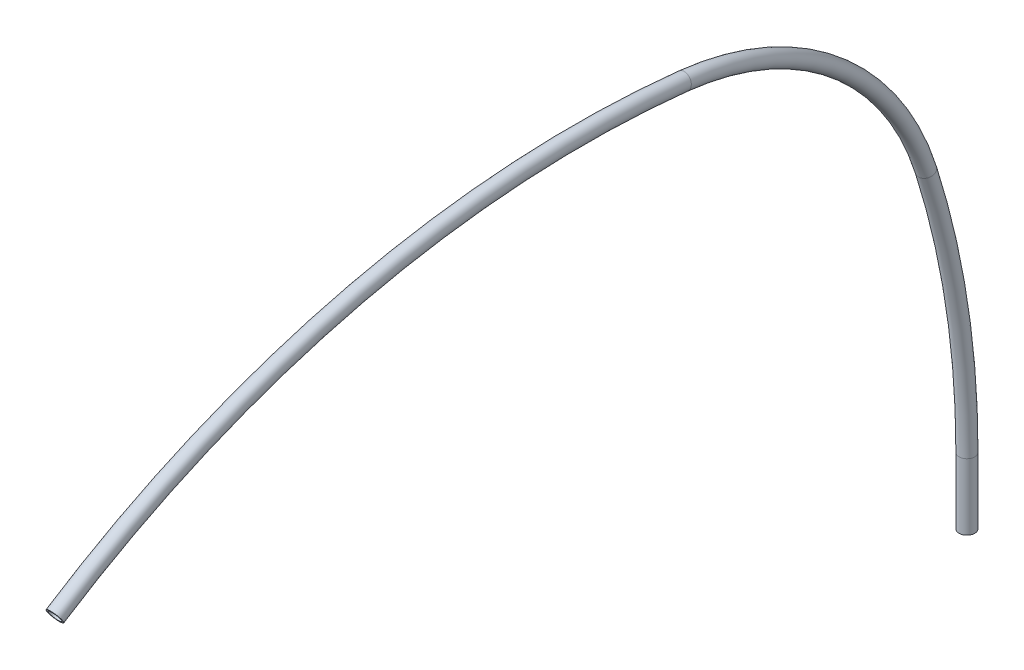
ISO-10303-21;
HEADER;
FILE_DESCRIPTION(('STEP AP214'),'2;1');
FILE_NAME('part.step','',(''),(''),'','','');
FILE_SCHEMA(('AUTOMOTIVE_DESIGN { 1 0 10303 214 1 1 1 1 }'));
ENDSEC;
DATA;
#1=APPLICATION_CONTEXT('core data for automotive mechanical design processes');
#2=APPLICATION_PROTOCOL_DEFINITION('international standard','automotive_design',2000,#1);
#3=PRODUCT_CONTEXT('',#1,'mechanical');
#4=PRODUCT('Part','Part','',(#3));
#5=PRODUCT_RELATED_PRODUCT_CATEGORY('part','',(#4));
#6=PRODUCT_DEFINITION_FORMATION('','',#4);
#7=PRODUCT_DEFINITION_CONTEXT('part definition',#1,'design');
#8=PRODUCT_DEFINITION('design','',#6,#7);
#9=PRODUCT_DEFINITION_SHAPE('','',#8);
#10=(LENGTH_UNIT() NAMED_UNIT(*) SI_UNIT(.MILLI.,.METRE.));
#11=(NAMED_UNIT(*) PLANE_ANGLE_UNIT() SI_UNIT($,.RADIAN.));
#12=(NAMED_UNIT(*) SI_UNIT($,.STERADIAN.) SOLID_ANGLE_UNIT());
#13=UNCERTAINTY_MEASURE_WITH_UNIT(LENGTH_MEASURE(1.E-05),#10,'distance_accuracy_value','');
#14=(GEOMETRIC_REPRESENTATION_CONTEXT(3) GLOBAL_UNCERTAINTY_ASSIGNED_CONTEXT((#13)) GLOBAL_UNIT_ASSIGNED_CONTEXT((#10,
#11,#12)) REPRESENTATION_CONTEXT('',''));
#15=CARTESIAN_POINT('',(0.,0.,0.));
#16=DIRECTION('',(0.,0.,1.));
#17=DIRECTION('',(1.,0.,0.));
#18=AXIS2_PLACEMENT_3D('',#15,#16,#17);
#19=CARTESIAN_POINT('',(0.,-235.741653141692,247.662939856084));
#20=DIRECTION('',(1.,0.,0.));
#21=DIRECTION('',(0.,0.,-1.));
#22=AXIS2_PLACEMENT_3D('',#19,#20,#21);
#23=TOROIDAL_SURFACE('',#22,618.018433937409,5.);
#24=CARTESIAN_POINT('',(0.,378.703607921638,181.301762626741));
#25=DIRECTION('',(0.,0.107377342786613,0.99421833932798));
#26=DIRECTION('',(0.,-0.99421833932798,0.107377342786613));
#27=AXIS2_PLACEMENT_3D('',#24,#25,#26);
#28=CIRCLE('',#27,5.);
#29=CARTESIAN_POINT('',(0.,383.674699618278,180.764875912808));
#30=VERTEX_POINT('',#29);
#31=EDGE_CURVE('E36',#30,#30,#28,.T.);
#32=CARTESIAN_POINT('',(0.,283.21782888428,583.263656037952));
#33=DIRECTION('',(0.,-0.543027032452331,0.839715214835372));
#34=DIRECTION('',(0.,-0.839715214835372,-0.543027032452331));
#35=AXIS2_PLACEMENT_3D('',#32,#33,#34);
#36=CIRCLE('',#35,5.);
#37=CARTESIAN_POINT('',(0.,287.416404958457,585.978791200213));
#38=VERTEX_POINT('',#37);
#39=EDGE_CURVE('E10',#38,#38,#36,.T.);
#40=CARTESIAN_POINT('',(0.,-235.741653141692,247.662939856084));
#41=DIRECTION('',(1.,0.,0.));
#42=DIRECTION('',(0.,0.,-1.));
#43=AXIS2_PLACEMENT_3D('',#40,#41,#42);
#44=CIRCLE('',#43,623.018433937409);
#45=EDGE_CURVE('',#30,#38,#44,.T.);
#46=ORIENTED_EDGE('',*,*,#31,.T.);
#47=ORIENTED_EDGE('',*,*,#39,.F.);
#48=ORIENTED_EDGE('',*,*,#45,.T.);
#49=ORIENTED_EDGE('',*,*,#45,.F.);
#50=EDGE_LOOP('',(#46,#48,#47,#49));
#51=FACE_BOUND('',#50,.T.);
#52=ADVANCED_FACE('F30',(#51),#23,.T.);
#53=CARTESIAN_POINT('',(0.,196.417143435808,200.989023873284));
#54=DIRECTION('',(1.,0.,0.));
#55=DIRECTION('',(0.,0.,-1.));
#56=AXIS2_PLACEMENT_3D('',#53,#54,#55);
#57=TOROIDAL_SURFACE('',#56,183.34651180247,5.);
#58=CARTESIAN_POINT('',(0.,251.810887526149,26.2106599211432));
#59=DIRECTION('',(0.,0.953268007304334,0.302125977449844));
#60=DIRECTION('',(0.,-0.302125977449844,0.953268007304334));
#61=AXIS2_PLACEMENT_3D('',#58,#59,#60);
#62=CIRCLE('',#61,5.);
#63=CARTESIAN_POINT('',(0.,253.321517413398,21.4443198846215));
#64=VERTEX_POINT('',#63);
#65=EDGE_CURVE('E40',#64,#64,#62,.T.);
#66=CARTESIAN_POINT('',(0.,196.417143435808,200.989023873284));
#67=DIRECTION('',(1.,0.,0.));
#68=DIRECTION('',(0.,0.,-1.));
#69=AXIS2_PLACEMENT_3D('',#66,#67,#68);
#70=CIRCLE('',#69,188.34651180247);
#71=EDGE_CURVE('',#64,#30,#70,.T.);
#72=ORIENTED_EDGE('',*,*,#65,.T.);
#73=ORIENTED_EDGE('',*,*,#31,.F.);
#74=ORIENTED_EDGE('',*,*,#71,.T.);
#75=ORIENTED_EDGE('',*,*,#71,.F.);
#76=EDGE_LOOP('',(#72,#74,#73,#75));
#77=FACE_BOUND('',#76,.T.);
#78=ADVANCED_FACE('F92',(#77),#57,.T.);
#79=CARTESIAN_POINT('',(0.,82.3569269417697,560.871865487007));
#80=DIRECTION('',(1.,0.,0.));
#81=DIRECTION('',(0.,0.,-1.));
#82=AXIS2_PLACEMENT_3D('',#79,#80,#81);
#83=TOROIDAL_SURFACE('',#82,560.871865487007,5.);
#84=CARTESIAN_POINT('',(0.,82.3569269417697,0.));
#85=DIRECTION('',(0.,1.,0.));
#86=DIRECTION('',(0.,0.,1.));
#87=AXIS2_PLACEMENT_3D('',#84,#85,#86);
#88=CIRCLE('',#87,5.);
#89=CARTESIAN_POINT('',(0.,82.3569269417697,-5.));
#90=VERTEX_POINT('',#89);
#91=EDGE_CURVE('E44',#90,#90,#88,.T.);
#92=CARTESIAN_POINT('',(0.,82.3569269417697,560.871865487007));
#93=DIRECTION('',(1.,0.,0.));
#94=DIRECTION('',(0.,0.,-1.));
#95=AXIS2_PLACEMENT_3D('',#92,#93,#94);
#96=CIRCLE('',#95,565.871865487007);
#97=EDGE_CURVE('',#90,#64,#96,.T.);
#98=ORIENTED_EDGE('',*,*,#91,.T.);
#99=ORIENTED_EDGE('',*,*,#65,.F.);
#100=ORIENTED_EDGE('',*,*,#97,.T.);
#101=ORIENTED_EDGE('',*,*,#97,.F.);
#102=EDGE_LOOP('',(#98,#100,#99,#101));
#103=FACE_BOUND('',#102,.T.);
#104=ADVANCED_FACE('F87',(#103),#83,.T.);
#105=CARTESIAN_POINT('',(0.,82.3569269417697,0.));
#106=DIRECTION('',(0.,-1.,0.));
#107=DIRECTION('',(0.,0.,-1.));
#108=AXIS2_PLACEMENT_3D('',#105,#106,#107);
#109=CYLINDRICAL_SURFACE('',#108,5.);
#110=CARTESIAN_POINT('',(0.,40.,0.));
#111=DIRECTION('',(0.,1.,0.));
#112=DIRECTION('',(0.,0.,1.));
#113=AXIS2_PLACEMENT_3D('',#110,#111,#112);
#114=CIRCLE('',#113,5.);
#115=CARTESIAN_POINT('',(0.,40.,-5.));
#116=VERTEX_POINT('',#115);
#117=EDGE_CURVE('E47',#116,#116,#114,.T.);
#118=CARTESIAN_POINT('',(0.,82.3569269417697,-5.));
#119=CARTESIAN_POINT('',(0.,81.915708952793,-5.));
#120=CARTESIAN_POINT('',(0.,81.4744909638162,-5.));
#121=CARTESIAN_POINT('',(0.,80.5920549858626,-5.));
#122=CARTESIAN_POINT('',(0.,80.1508369968859,-5.));
#123=CARTESIAN_POINT('',(0.,79.2684010189323,-5.));
#124=CARTESIAN_POINT('',(0.,78.8271830299556,-5.));
#125=CARTESIAN_POINT('',(0.,77.944747052002,-5.));
#126=CARTESIAN_POINT('',(0.,77.5035290630253,-5.));
#127=CARTESIAN_POINT('',(0.,76.6210930850717,-5.));
#128=CARTESIAN_POINT('',(0.,76.179875096095,-5.));
#129=CARTESIAN_POINT('',(0.,75.2974391181414,-5.));
#130=CARTESIAN_POINT('',(0.,74.8562211291647,-5.));
#131=CARTESIAN_POINT('',(0.,73.9737851512111,-5.));
#132=CARTESIAN_POINT('',(0.,73.5325671622344,-5.));
#133=CARTESIAN_POINT('',(0.,72.6501311842808,-5.));
#134=CARTESIAN_POINT('',(0.,72.2089131953041,-5.));
#135=CARTESIAN_POINT('',(0.,71.3264772173505,-5.));
#136=CARTESIAN_POINT('',(0.,70.8852592283738,-5.));
#137=CARTESIAN_POINT('',(0.,70.0028232504202,-5.));
#138=CARTESIAN_POINT('',(0.,69.5616052614434,-5.));
#139=CARTESIAN_POINT('',(0.,68.6791692834899,-5.));
#140=CARTESIAN_POINT('',(0.,68.2379512945131,-5.));
#141=CARTESIAN_POINT('',(0.,67.3555153165596,-5.));
#142=CARTESIAN_POINT('',(0.,66.9142973275828,-5.));
#143=CARTESIAN_POINT('',(0.,66.0318613496293,-5.));
#144=CARTESIAN_POINT('',(0.,65.5906433606525,-5.));
#145=CARTESIAN_POINT('',(0.,64.708207382699,-5.));
#146=CARTESIAN_POINT('',(0.,64.2669893937222,-5.));
#147=CARTESIAN_POINT('',(0.,63.3845534157687,-5.));
#148=CARTESIAN_POINT('',(0.,62.9433354267919,-5.));
#149=CARTESIAN_POINT('',(0.,62.0608994488384,-5.));
#150=CARTESIAN_POINT('',(0.,61.6196814598616,-5.));
#151=CARTESIAN_POINT('',(0.,60.7372454819081,-5.));
#152=CARTESIAN_POINT('',(0.,60.2960274929313,-5.));
#153=CARTESIAN_POINT('',(0.,59.4135915149778,-5.));
#154=CARTESIAN_POINT('',(0.,58.972373526001,-5.));
#155=CARTESIAN_POINT('',(0.,58.0899375480475,-5.));
#156=CARTESIAN_POINT('',(0.,57.6487195590707,-5.));
#157=CARTESIAN_POINT('',(0.,56.7662835811172,-5.));
#158=CARTESIAN_POINT('',(0.,56.3250655921404,-5.));
#159=CARTESIAN_POINT('',(0.,55.4426296141869,-5.));
#160=CARTESIAN_POINT('',(0.,55.0014116252101,-5.));
#161=CARTESIAN_POINT('',(0.,54.1189756472566,-5.));
#162=CARTESIAN_POINT('',(0.,53.6777576582798,-5.));
#163=CARTESIAN_POINT('',(0.,52.7953216803263,-5.));
#164=CARTESIAN_POINT('',(0.,52.3541036913495,-5.));
#165=CARTESIAN_POINT('',(0.,51.471667713396,-5.));
#166=CARTESIAN_POINT('',(0.,51.0304497244192,-5.));
#167=CARTESIAN_POINT('',(0.,50.1480137464657,-5.));
#168=CARTESIAN_POINT('',(0.,49.7067957574889,-5.));
#169=CARTESIAN_POINT('',(0.,48.8243597795354,-5.));
#170=CARTESIAN_POINT('',(0.,48.3831417905586,-5.));
#171=CARTESIAN_POINT('',(0.,47.5007058126051,-5.));
#172=CARTESIAN_POINT('',(0.,47.0594878236283,-5.));
#173=CARTESIAN_POINT('',(0.,46.1770518456747,-5.));
#174=CARTESIAN_POINT('',(0.,45.735833856698,-5.));
#175=CARTESIAN_POINT('',(0.,44.8533978787444,-5.));
#176=CARTESIAN_POINT('',(0.,44.4121798897677,-5.));
#177=CARTESIAN_POINT('',(0.,43.5297439118141,-5.));
#178=CARTESIAN_POINT('',(0.,43.0885259228374,-5.));
#179=CARTESIAN_POINT('',(0.,42.2060899448838,-5.));
#180=CARTESIAN_POINT('',(0.,41.7648719559071,-5.));
#181=CARTESIAN_POINT('',(0.,40.8824359779535,-5.));
#182=CARTESIAN_POINT('',(0.,40.4412179889768,-5.));
#183=CARTESIAN_POINT('',(0.,40.,-5.));
#184=B_SPLINE_CURVE_WITH_KNOTS('',3,(#118,#119,#120,#121,#122,#123,#124,#125,#126,#127,#128,
#129,#130,#131,#132,#133,#134,#135,#136,#137,#138,#139,#140,#141,#142,#143,#144,#145,#146,#147,
#148,#149,#150,#151,#152,#153,#154,#155,#156,#157,#158,#159,#160,#161,#162,#163,#164,#165,#166,
#167,#168,#169,#170,#171,#172,#173,#174,#175,#176,#177,#178,#179,#180,#181,#182,#183),
.UNSPECIFIED.,.F.,.F.,(4,2,2,2,2,2,2,2,2,2,2,2,2,2,2,2,2,2,2,2,2,2,2,2,2,2,2,2,2,2,2,2,4),(0.,
1.32365396693031,2.64730793386062,3.97096190079092,5.29461586772122,6.61826983465152,
7.94192380158183,9.26557776851213,10.5892317354424,11.9128857023727,13.236539669303,
14.5601936362334,15.8838476031636,17.207501570094,18.5311555370243,19.8548095039546,
21.1784634708849,22.5021174378152,23.8257714047455,25.1494253716758,26.4730793386061,
27.7967333055364,29.1203872724667,30.444041239397,31.7676952063273,33.0913491732576,
34.4150031401879,35.7386571071182,37.0623110740485,38.3859650409788,39.7096190079091,
41.0332729748394,42.3569269417697),.UNSPECIFIED.);
#185=EDGE_CURVE('BSEAM79',#90,#116,#184,.T.);
#186=ORIENTED_EDGE('',*,*,#91,.F.);
#187=ORIENTED_EDGE('',*,*,#117,.T.);
#188=ORIENTED_EDGE('',*,*,#185,.T.);
#189=ORIENTED_EDGE('',*,*,#185,.F.);
#190=EDGE_LOOP('',(#186,#188,#187,#189));
#191=FACE_BOUND('',#190,.T.);
#192=ADVANCED_FACE('F79',(#191),#109,.T.);
#193=CARTESIAN_POINT('',(0.,283.21782888428,583.263656037952));
#194=DIRECTION('',(0.,-0.543027032452331,0.839715214835372));
#195=DIRECTION('',(0.,-0.839715214835372,-0.543027032452331));
#196=AXIS2_PLACEMENT_3D('',#193,#194,#195);
#197=PLANE('',#196);
#198=CARTESIAN_POINT('',(0.,283.21782888428,583.263656037952));
#199=DIRECTION('',(0.,-0.543027032452331,0.839715214835372));
#200=DIRECTION('',(0.,-0.839715214835372,-0.543027032452331));
#201=AXIS2_PLACEMENT_3D('',#198,#199,#200);
#202=CIRCLE('',#201,4.);
#203=CARTESIAN_POINT('',(0.,286.576689743622,585.435764167762));
#204=VERTEX_POINT('',#203);
#205=EDGE_CURVE('E50',#204,#204,#202,.T.);
#206=ORIENTED_EDGE('',*,*,#205,.F.);
#207=EDGE_LOOP('',(#206));
#208=FACE_BOUND('',#207,.T.);
#209=ORIENTED_EDGE('',*,*,#39,.T.);
#210=EDGE_LOOP('',(#209));
#211=FACE_BOUND('',#210,.T.);
#212=ADVANCED_FACE('F77',(#208,#211),#197,.T.);
#213=CARTESIAN_POINT('',(0.,40.,0.));
#214=DIRECTION('',(0.,1.,0.));
#215=DIRECTION('',(0.,0.,1.));
#216=AXIS2_PLACEMENT_3D('',#213,#214,#215);
#217=PLANE('',#216);
#218=CARTESIAN_POINT('',(0.,40.,0.));
#219=DIRECTION('',(0.,1.,0.));
#220=DIRECTION('',(0.,0.,1.));
#221=AXIS2_PLACEMENT_3D('',#218,#219,#220);
#222=CIRCLE('',#221,4.);
#223=CARTESIAN_POINT('',(0.,40.,-4.));
#224=VERTEX_POINT('',#223);
#225=EDGE_CURVE('E53',#224,#224,#222,.T.);
#226=ORIENTED_EDGE('',*,*,#225,.T.);
#227=EDGE_LOOP('',(#226));
#228=FACE_BOUND('',#227,.T.);
#229=ORIENTED_EDGE('',*,*,#117,.F.);
#230=EDGE_LOOP('',(#229));
#231=FACE_BOUND('',#230,.T.);
#232=ADVANCED_FACE('F73',(#228,#231),#217,.F.);
#233=CARTESIAN_POINT('',(0.,-235.741653141692,247.662939856084));
#234=DIRECTION('',(1.,0.,0.));
#235=DIRECTION('',(0.,0.,-1.));
#236=AXIS2_PLACEMENT_3D('',#233,#234,#235);
#237=TOROIDAL_SURFACE('',#236,618.018433937409,4.);
#238=CARTESIAN_POINT('',(0.,378.703607921638,181.301762626741));
#239=DIRECTION('',(0.,-0.107377342786614,-0.99421833932798));
#240=DIRECTION('',(0.,0.99421833932798,-0.107377342786614));
#241=AXIS2_PLACEMENT_3D('',#238,#239,#240);
#242=CIRCLE('',#241,4.);
#243=CARTESIAN_POINT('',(0.,382.68048127895,180.872253255594));
#244=VERTEX_POINT('',#243);
#245=EDGE_CURVE('E59',#244,#244,#242,.F.);
#246=CARTESIAN_POINT('',(0.,-235.741653141692,247.662939856084));
#247=DIRECTION('',(1.,0.,0.));
#248=DIRECTION('',(0.,0.,-1.));
#249=AXIS2_PLACEMENT_3D('',#246,#247,#248);
#250=CIRCLE('',#249,622.018433937409);
#251=EDGE_CURVE('',#244,#204,#250,.T.);
#252=ORIENTED_EDGE('',*,*,#245,.F.);
#253=ORIENTED_EDGE('',*,*,#205,.T.);
#254=ORIENTED_EDGE('',*,*,#251,.T.);
#255=ORIENTED_EDGE('',*,*,#251,.F.);
#256=EDGE_LOOP('',(#252,#254,#253,#255));
#257=FACE_BOUND('',#256,.T.);
#258=ADVANCED_FACE('F70',(#257),#237,.F.);
#259=CARTESIAN_POINT('',(0.,196.417143435808,200.989023873284));
#260=DIRECTION('',(1.,0.,0.));
#261=DIRECTION('',(0.,0.,-1.));
#262=AXIS2_PLACEMENT_3D('',#259,#260,#261);
#263=TOROIDAL_SURFACE('',#262,183.34651180247,4.);
#264=CARTESIAN_POINT('',(0.,251.810887526149,26.2106599211432));
#265=DIRECTION('',(0.,-0.953268007304334,-0.302125977449843));
#266=DIRECTION('',(0.,0.302125977449843,-0.953268007304334));
#267=AXIS2_PLACEMENT_3D('',#264,#265,#266);
#268=CIRCLE('',#267,4.);
#269=CARTESIAN_POINT('',(0.,253.019391435948,22.3975878919258));
#270=VERTEX_POINT('',#269);
#271=EDGE_CURVE('E62',#270,#270,#268,.F.);
#272=CARTESIAN_POINT('',(0.,196.417143435808,200.989023873284));
#273=DIRECTION('',(1.,0.,0.));
#274=DIRECTION('',(0.,0.,-1.));
#275=AXIS2_PLACEMENT_3D('',#272,#273,#274);
#276=CIRCLE('',#275,187.34651180247);
#277=EDGE_CURVE('',#270,#244,#276,.T.);
#278=ORIENTED_EDGE('',*,*,#271,.F.);
#279=ORIENTED_EDGE('',*,*,#245,.T.);
#280=ORIENTED_EDGE('',*,*,#277,.T.);
#281=ORIENTED_EDGE('',*,*,#277,.F.);
#282=EDGE_LOOP('',(#278,#280,#279,#281));
#283=FACE_BOUND('',#282,.T.);
#284=ADVANCED_FACE('F68',(#283),#263,.F.);
#285=CARTESIAN_POINT('',(0.,82.3569269417697,560.871865487007));
#286=DIRECTION('',(1.,0.,0.));
#287=DIRECTION('',(0.,0.,-1.));
#288=AXIS2_PLACEMENT_3D('',#285,#286,#287);
#289=TOROIDAL_SURFACE('',#288,560.871865487007,4.);
#290=CARTESIAN_POINT('',(0.,82.3569269417697,0.));
#291=DIRECTION('',(0.,-1.,0.));
#292=DIRECTION('',(0.,0.,-1.));
#293=AXIS2_PLACEMENT_3D('',#290,#291,#292);
#294=CIRCLE('',#293,4.);
#295=CARTESIAN_POINT('',(0.,82.3569269417697,-4.));
#296=VERTEX_POINT('',#295);
#297=EDGE_CURVE('E56',#296,#296,#294,.F.);
#298=CARTESIAN_POINT('',(0.,82.3569269417697,560.871865487007));
#299=DIRECTION('',(1.,0.,0.));
#300=DIRECTION('',(0.,0.,-1.));
#301=AXIS2_PLACEMENT_3D('',#298,#299,#300);
#302=CIRCLE('',#301,564.871865487007);
#303=EDGE_CURVE('',#296,#270,#302,.T.);
#304=ORIENTED_EDGE('',*,*,#297,.F.);
#305=ORIENTED_EDGE('',*,*,#271,.T.);
#306=ORIENTED_EDGE('',*,*,#303,.T.);
#307=ORIENTED_EDGE('',*,*,#303,.F.);
#308=EDGE_LOOP('',(#304,#306,#305,#307));
#309=FACE_BOUND('',#308,.T.);
#310=ADVANCED_FACE('F144',(#309),#289,.F.);
#311=CARTESIAN_POINT('',(0.,82.3569269417697,0.));
#312=DIRECTION('',(0.,-1.,0.));
#313=DIRECTION('',(0.,0.,-1.));
#314=AXIS2_PLACEMENT_3D('',#311,#312,#313);
#315=CYLINDRICAL_SURFACE('',#314,4.);
#316=CARTESIAN_POINT('',(0.,82.3569269417697,-4.));
#317=CARTESIAN_POINT('',(0.,81.9157089527929,-4.));
#318=CARTESIAN_POINT('',(0.,81.4744909638162,-4.));
#319=CARTESIAN_POINT('',(0.,80.5920549858626,-4.));
#320=CARTESIAN_POINT('',(0.,80.1508369968859,-4.));
#321=CARTESIAN_POINT('',(0.,79.2684010189323,-4.));
#322=CARTESIAN_POINT('',(0.,78.8271830299556,-4.));
#323=CARTESIAN_POINT('',(0.,77.944747052002,-4.));
#324=CARTESIAN_POINT('',(0.,77.5035290630253,-4.));
#325=CARTESIAN_POINT('',(0.,76.6210930850717,-4.));
#326=CARTESIAN_POINT('',(0.,76.179875096095,-4.));
#327=CARTESIAN_POINT('',(0.,75.2974391181414,-4.));
#328=CARTESIAN_POINT('',(0.,74.8562211291647,-4.));
#329=CARTESIAN_POINT('',(0.,73.9737851512111,-4.));
#330=CARTESIAN_POINT('',(0.,73.5325671622344,-4.));
#331=CARTESIAN_POINT('',(0.,72.6501311842808,-4.));
#332=CARTESIAN_POINT('',(0.,72.2089131953041,-4.));
#333=CARTESIAN_POINT('',(0.,71.3264772173505,-4.));
#334=CARTESIAN_POINT('',(0.,70.8852592283738,-4.));
#335=CARTESIAN_POINT('',(0.,70.0028232504202,-4.));
#336=CARTESIAN_POINT('',(0.,69.5616052614434,-4.));
#337=CARTESIAN_POINT('',(0.,68.6791692834899,-4.));
#338=CARTESIAN_POINT('',(0.,68.2379512945131,-4.));
#339=CARTESIAN_POINT('',(0.,67.3555153165596,-4.));
#340=CARTESIAN_POINT('',(0.,66.9142973275828,-4.));
#341=CARTESIAN_POINT('',(0.,66.0318613496293,-4.));
#342=CARTESIAN_POINT('',(0.,65.5906433606525,-4.));
#343=CARTESIAN_POINT('',(0.,64.708207382699,-4.));
#344=CARTESIAN_POINT('',(0.,64.2669893937222,-4.));
#345=CARTESIAN_POINT('',(0.,63.3845534157687,-4.));
#346=CARTESIAN_POINT('',(0.,62.9433354267919,-4.));
#347=CARTESIAN_POINT('',(0.,62.0608994488384,-4.));
#348=CARTESIAN_POINT('',(0.,61.6196814598616,-4.));
#349=CARTESIAN_POINT('',(0.,60.7372454819081,-4.));
#350=CARTESIAN_POINT('',(0.,60.2960274929313,-4.));
#351=CARTESIAN_POINT('',(0.,59.4135915149778,-4.));
#352=CARTESIAN_POINT('',(0.,58.972373526001,-4.));
#353=CARTESIAN_POINT('',(0.,58.0899375480475,-4.));
#354=CARTESIAN_POINT('',(0.,57.6487195590707,-4.));
#355=CARTESIAN_POINT('',(0.,56.7662835811172,-4.));
#356=CARTESIAN_POINT('',(0.,56.3250655921404,-4.));
#357=CARTESIAN_POINT('',(0.,55.4426296141869,-4.));
#358=CARTESIAN_POINT('',(0.,55.0014116252101,-4.));
#359=CARTESIAN_POINT('',(0.,54.1189756472566,-4.));
#360=CARTESIAN_POINT('',(0.,53.6777576582798,-4.));
#361=CARTESIAN_POINT('',(0.,52.7953216803263,-4.));
#362=CARTESIAN_POINT('',(0.,52.3541036913495,-4.));
#363=CARTESIAN_POINT('',(0.,51.471667713396,-4.));
#364=CARTESIAN_POINT('',(0.,51.0304497244192,-4.));
#365=CARTESIAN_POINT('',(0.,50.1480137464657,-4.));
#366=CARTESIAN_POINT('',(0.,49.7067957574889,-4.));
#367=CARTESIAN_POINT('',(0.,48.8243597795354,-4.));
#368=CARTESIAN_POINT('',(0.,48.3831417905586,-4.));
#369=CARTESIAN_POINT('',(0.,47.5007058126051,-4.));
#370=CARTESIAN_POINT('',(0.,47.0594878236283,-4.));
#371=CARTESIAN_POINT('',(0.,46.1770518456747,-4.));
#372=CARTESIAN_POINT('',(0.,45.735833856698,-4.));
#373=CARTESIAN_POINT('',(0.,44.8533978787444,-4.));
#374=CARTESIAN_POINT('',(0.,44.4121798897677,-4.));
#375=CARTESIAN_POINT('',(0.,43.5297439118141,-4.));
#376=CARTESIAN_POINT('',(0.,43.0885259228374,-4.));
#377=CARTESIAN_POINT('',(0.,42.2060899448838,-4.));
#378=CARTESIAN_POINT('',(0.,41.7648719559071,-4.));
#379=CARTESIAN_POINT('',(0.,40.8824359779535,-4.));
#380=CARTESIAN_POINT('',(0.,40.4412179889768,-4.));
#381=CARTESIAN_POINT('',(0.,40.,-4.));
#382=B_SPLINE_CURVE_WITH_KNOTS('',3,(#316,#317,#318,#319,#320,#321,#322,#323,#324,#325,#326,
#327,#328,#329,#330,#331,#332,#333,#334,#335,#336,#337,#338,#339,#340,#341,#342,#343,#344,#345,
#346,#347,#348,#349,#350,#351,#352,#353,#354,#355,#356,#357,#358,#359,#360,#361,#362,#363,#364,
#365,#366,#367,#368,#369,#370,#371,#372,#373,#374,#375,#376,#377,#378,#379,#380,#381),
.UNSPECIFIED.,.F.,.F.,(4,2,2,2,2,2,2,2,2,2,2,2,2,2,2,2,2,2,2,2,2,2,2,2,2,2,2,2,2,2,2,2,4),(0.,
1.32365396693029,2.6473079338606,3.97096190079091,5.2946158677212,6.61826983465151,
7.94192380158182,9.26557776851211,10.5892317354424,11.9128857023727,13.236539669303,
14.5601936362333,15.8838476031636,17.2075015700939,18.5311555370243,19.8548095039545,
21.1784634708849,22.5021174378152,23.8257714047455,25.1494253716758,26.4730793386061,
27.7967333055364,29.1203872724667,30.444041239397,31.7676952063273,33.0913491732576,
34.4150031401879,35.7386571071182,37.0623110740485,38.3859650409788,39.7096190079091,
41.0332729748394,42.3569269417697),.UNSPECIFIED.);
#383=EDGE_CURVE('BSEAM154',#296,#224,#382,.T.);
#384=ORIENTED_EDGE('',*,*,#297,.T.);
#385=ORIENTED_EDGE('',*,*,#225,.F.);
#386=ORIENTED_EDGE('',*,*,#383,.T.);
#387=ORIENTED_EDGE('',*,*,#383,.F.);
#388=EDGE_LOOP('',(#384,#386,#385,#387));
#389=FACE_BOUND('',#388,.T.);
#390=ADVANCED_FACE('F154',(#389),#315,.F.);
#391=CLOSED_SHELL('',(#52,#78,#104,#192,#212,#232,#258,#284,#310,#390));
#392=MANIFOLD_SOLID_BREP('B2',#391);
#393=ADVANCED_BREP_SHAPE_REPRESENTATION('',(#18,#392),#14);
#394=SHAPE_DEFINITION_REPRESENTATION(#9,#393);
ENDSEC;
END-ISO-10303-21;
